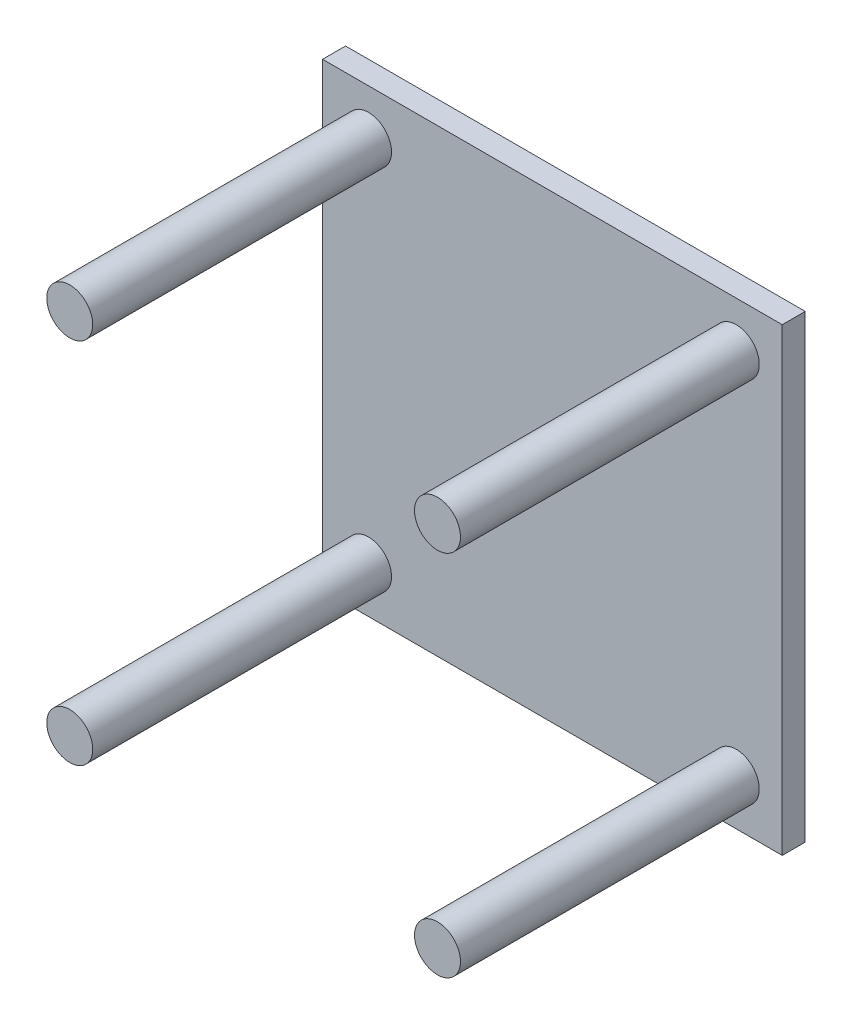
ISO-10303-21;
HEADER;
FILE_DESCRIPTION(('STEP AP214'),'2;1');
FILE_NAME('part.step','',(''),(''),'','','');
FILE_SCHEMA(('AUTOMOTIVE_DESIGN { 1 0 10303 214 1 1 1 1 }'));
ENDSEC;
DATA;
#1=APPLICATION_CONTEXT('core data for automotive mechanical design processes');
#2=APPLICATION_PROTOCOL_DEFINITION('international standard','automotive_design',2000,#1);
#3=PRODUCT_CONTEXT('',#1,'mechanical');
#4=PRODUCT('Part','Part','',(#3));
#5=PRODUCT_RELATED_PRODUCT_CATEGORY('part','',(#4));
#6=PRODUCT_DEFINITION_FORMATION('','',#4);
#7=PRODUCT_DEFINITION_CONTEXT('part definition',#1,'design');
#8=PRODUCT_DEFINITION('design','',#6,#7);
#9=PRODUCT_DEFINITION_SHAPE('','',#8);
#10=(LENGTH_UNIT() NAMED_UNIT(*) SI_UNIT(.MILLI.,.METRE.));
#11=(NAMED_UNIT(*) PLANE_ANGLE_UNIT() SI_UNIT($,.RADIAN.));
#12=(NAMED_UNIT(*) SI_UNIT($,.STERADIAN.) SOLID_ANGLE_UNIT());
#13=UNCERTAINTY_MEASURE_WITH_UNIT(LENGTH_MEASURE(1.E-05),#10,'distance_accuracy_value','');
#14=(GEOMETRIC_REPRESENTATION_CONTEXT(3) GLOBAL_UNCERTAINTY_ASSIGNED_CONTEXT((#13)) GLOBAL_UNIT_ASSIGNED_CONTEXT((#10,
#11,#12)) REPRESENTATION_CONTEXT('',''));
#15=CARTESIAN_POINT('',(0.,0.,0.));
#16=DIRECTION('',(0.,0.,1.));
#17=DIRECTION('',(1.,0.,0.));
#18=AXIS2_PLACEMENT_3D('',#15,#16,#17);
#19=CARTESIAN_POINT('',(500.,-500.,50.));
#20=DIRECTION('',(-1.,0.,0.));
#21=DIRECTION('',(0.,0.,1.));
#22=AXIS2_PLACEMENT_3D('',#19,#20,#21);
#23=PLANE('',#22);
#24=DIRECTION('',(0.,1.,0.));
#25=VECTOR('',#24,1.);
#26=CARTESIAN_POINT('',(500.,-500.,0.));
#27=LINE('',#26,#25);
#28=CARTESIAN_POINT('',(500.,-500.,0.));
#29=VERTEX_POINT('',#28);
#30=CARTESIAN_POINT('',(500.,500.,0.));
#31=VERTEX_POINT('',#30);
#32=EDGE_CURVE('E108',#29,#31,#27,.T.);
#33=ORIENTED_EDGE('',*,*,#32,.T.);
#34=DIRECTION('',(0.,0.,-1.));
#35=VECTOR('',#34,1.);
#36=CARTESIAN_POINT('',(500.,500.,50.));
#37=LINE('',#36,#35);
#38=CARTESIAN_POINT('',(500.,500.,50.));
#39=VERTEX_POINT('',#38);
#40=EDGE_CURVE('E44',#39,#31,#37,.T.);
#41=ORIENTED_EDGE('',*,*,#40,.F.);
#42=DIRECTION('',(0.,1.,0.));
#43=VECTOR('',#42,1.);
#44=CARTESIAN_POINT('',(500.,-500.,50.));
#45=LINE('',#44,#43);
#46=CARTESIAN_POINT('',(500.,-500.,50.));
#47=VERTEX_POINT('',#46);
#48=EDGE_CURVE('E95',#47,#39,#45,.T.);
#49=ORIENTED_EDGE('',*,*,#48,.F.);
#50=DIRECTION('',(0.,0.,-1.));
#51=VECTOR('',#50,1.);
#52=CARTESIAN_POINT('',(500.,-500.,50.));
#53=LINE('',#52,#51);
#54=EDGE_CURVE('E104',#47,#29,#53,.T.);
#55=ORIENTED_EDGE('',*,*,#54,.T.);
#56=EDGE_LOOP('',(#33,#41,#49,#55));
#57=FACE_BOUND('',#56,.T.);
#58=ADVANCED_FACE('F41',(#57),#23,.F.);
#59=CARTESIAN_POINT('',(-500.,500.,50.));
#60=DIRECTION('',(0.,-1.,0.));
#61=DIRECTION('',(0.,0.,-1.));
#62=AXIS2_PLACEMENT_3D('',#59,#60,#61);
#63=PLANE('',#62);
#64=DIRECTION('',(-1.,0.,0.));
#65=VECTOR('',#64,1.);
#66=CARTESIAN_POINT('',(-500.,500.,0.));
#67=LINE('',#66,#65);
#68=CARTESIAN_POINT('',(-500.,500.,0.));
#69=VERTEX_POINT('',#68);
#70=EDGE_CURVE('E100',#31,#69,#67,.T.);
#71=ORIENTED_EDGE('',*,*,#70,.T.);
#72=DIRECTION('',(0.,0.,-1.));
#73=VECTOR('',#72,1.);
#74=CARTESIAN_POINT('',(-500.,500.,50.));
#75=LINE('',#74,#73);
#76=CARTESIAN_POINT('',(-500.,500.,50.));
#77=VERTEX_POINT('',#76);
#78=EDGE_CURVE('E98',#77,#69,#75,.T.);
#79=ORIENTED_EDGE('',*,*,#78,.F.);
#80=DIRECTION('',(-1.,0.,0.));
#81=VECTOR('',#80,1.);
#82=CARTESIAN_POINT('',(-500.,500.,50.));
#83=LINE('',#82,#81);
#84=EDGE_CURVE('E90',#39,#77,#83,.T.);
#85=ORIENTED_EDGE('',*,*,#84,.F.);
#86=ORIENTED_EDGE('',*,*,#40,.T.);
#87=EDGE_LOOP('',(#71,#79,#85,#86));
#88=FACE_BOUND('',#87,.T.);
#89=ADVANCED_FACE('F99',(#88),#63,.F.);
#90=CARTESIAN_POINT('',(-500.,-500.,50.));
#91=DIRECTION('',(1.,0.,0.));
#92=DIRECTION('',(0.,0.,-1.));
#93=AXIS2_PLACEMENT_3D('',#90,#91,#92);
#94=PLANE('',#93);
#95=DIRECTION('',(0.,-1.,0.));
#96=VECTOR('',#95,1.);
#97=CARTESIAN_POINT('',(-500.,-500.,0.));
#98=LINE('',#97,#96);
#99=CARTESIAN_POINT('',(-500.,-500.,0.));
#100=VERTEX_POINT('',#99);
#101=EDGE_CURVE('E76',#69,#100,#98,.T.);
#102=ORIENTED_EDGE('',*,*,#101,.T.);
#103=DIRECTION('',(0.,0.,-1.));
#104=VECTOR('',#103,1.);
#105=CARTESIAN_POINT('',(-500.,-500.,50.));
#106=LINE('',#105,#104);
#107=CARTESIAN_POINT('',(-500.,-500.,50.));
#108=VERTEX_POINT('',#107);
#109=EDGE_CURVE('E101',#108,#100,#106,.T.);
#110=ORIENTED_EDGE('',*,*,#109,.F.);
#111=DIRECTION('',(0.,-1.,0.));
#112=VECTOR('',#111,1.);
#113=CARTESIAN_POINT('',(-500.,-500.,50.));
#114=LINE('',#113,#112);
#115=EDGE_CURVE('E93',#77,#108,#114,.T.);
#116=ORIENTED_EDGE('',*,*,#115,.F.);
#117=ORIENTED_EDGE('',*,*,#78,.T.);
#118=EDGE_LOOP('',(#102,#110,#116,#117));
#119=FACE_BOUND('',#118,.T.);
#120=ADVANCED_FACE('F102',(#119),#94,.F.);
#121=CARTESIAN_POINT('',(-500.,-500.,50.));
#122=DIRECTION('',(0.,1.,0.));
#123=DIRECTION('',(0.,0.,1.));
#124=AXIS2_PLACEMENT_3D('',#121,#122,#123);
#125=PLANE('',#124);
#126=DIRECTION('',(1.,0.,0.));
#127=VECTOR('',#126,1.);
#128=CARTESIAN_POINT('',(-500.,-500.,0.));
#129=LINE('',#128,#127);
#130=EDGE_CURVE('E82',#100,#29,#129,.T.);
#131=ORIENTED_EDGE('',*,*,#130,.T.);
#132=ORIENTED_EDGE('',*,*,#54,.F.);
#133=DIRECTION('',(1.,0.,0.));
#134=VECTOR('',#133,1.);
#135=CARTESIAN_POINT('',(-500.,-500.,50.));
#136=LINE('',#135,#134);
#137=EDGE_CURVE('E59',#108,#47,#136,.T.);
#138=ORIENTED_EDGE('',*,*,#137,.F.);
#139=ORIENTED_EDGE('',*,*,#109,.T.);
#140=EDGE_LOOP('',(#131,#132,#138,#139));
#141=FACE_BOUND('',#140,.T.);
#142=ADVANCED_FACE('F116',(#141),#125,.F.);
#143=CARTESIAN_POINT('',(0.,0.,50.));
#144=DIRECTION('',(0.,0.,-1.));
#145=DIRECTION('',(-1.,0.,0.));
#146=AXIS2_PLACEMENT_3D('',#143,#144,#145);
#147=PLANE('',#146);
#148=CARTESIAN_POINT('',(-400.,-400.,50.));
#149=DIRECTION('',(0.,0.,-1.));
#150=DIRECTION('',(-1.,0.,0.));
#151=AXIS2_PLACEMENT_3D('',#148,#149,#150);
#152=CIRCLE('',#151,50.);
#153=CARTESIAN_POINT('',(-450.,-400.,50.));
#154=VERTEX_POINT('',#153);
#155=EDGE_CURVE('E11',#154,#154,#152,.F.);
#156=ORIENTED_EDGE('',*,*,#155,.F.);
#157=EDGE_LOOP('',(#156));
#158=FACE_BOUND('',#157,.T.);
#159=CARTESIAN_POINT('',(400.,-400.,50.));
#160=DIRECTION('',(0.,0.,-1.));
#161=DIRECTION('',(-1.,0.,0.));
#162=AXIS2_PLACEMENT_3D('',#159,#160,#161);
#163=CIRCLE('',#162,50.);
#164=CARTESIAN_POINT('',(350.,-400.,50.));
#165=VERTEX_POINT('',#164);
#166=EDGE_CURVE('E50',#165,#165,#163,.F.);
#167=ORIENTED_EDGE('',*,*,#166,.F.);
#168=EDGE_LOOP('',(#167));
#169=FACE_BOUND('',#168,.T.);
#170=CARTESIAN_POINT('',(-400.,400.,50.));
#171=DIRECTION('',(0.,0.,-1.));
#172=DIRECTION('',(-1.,0.,0.));
#173=AXIS2_PLACEMENT_3D('',#170,#171,#172);
#174=CIRCLE('',#173,50.);
#175=CARTESIAN_POINT('',(-450.,400.,50.));
#176=VERTEX_POINT('',#175);
#177=EDGE_CURVE('E125',#176,#176,#174,.F.);
#178=ORIENTED_EDGE('',*,*,#177,.F.);
#179=EDGE_LOOP('',(#178));
#180=FACE_BOUND('',#179,.T.);
#181=CARTESIAN_POINT('',(400.,400.,50.));
#182=DIRECTION('',(0.,0.,-1.));
#183=DIRECTION('',(-1.,0.,0.));
#184=AXIS2_PLACEMENT_3D('',#181,#182,#183);
#185=CIRCLE('',#184,50.);
#186=CARTESIAN_POINT('',(350.,400.,50.));
#187=VERTEX_POINT('',#186);
#188=EDGE_CURVE('E122',#187,#187,#185,.F.);
#189=ORIENTED_EDGE('',*,*,#188,.F.);
#190=EDGE_LOOP('',(#189));
#191=FACE_BOUND('',#190,.T.);
#192=ORIENTED_EDGE('',*,*,#48,.T.);
#193=ORIENTED_EDGE('',*,*,#84,.T.);
#194=ORIENTED_EDGE('',*,*,#115,.T.);
#195=ORIENTED_EDGE('',*,*,#137,.T.);
#196=EDGE_LOOP('',(#192,#193,#194,#195));
#197=FACE_BOUND('',#196,.T.);
#198=ADVANCED_FACE('F91',(#158,#169,#180,#191,#197),#147,.F.);
#199=CARTESIAN_POINT('',(0.,0.,0.));
#200=DIRECTION('',(0.,0.,-1.));
#201=DIRECTION('',(-1.,0.,0.));
#202=AXIS2_PLACEMENT_3D('',#199,#200,#201);
#203=PLANE('',#202);
#204=ORIENTED_EDGE('',*,*,#32,.F.);
#205=ORIENTED_EDGE('',*,*,#130,.F.);
#206=ORIENTED_EDGE('',*,*,#101,.F.);
#207=ORIENTED_EDGE('',*,*,#70,.F.);
#208=EDGE_LOOP('',(#204,#205,#206,#207));
#209=FACE_BOUND('',#208,.T.);
#210=ADVANCED_FACE('F119',(#209),#203,.T.);
#211=CARTESIAN_POINT('',(400.,400.,700.));
#212=DIRECTION('',(0.,0.,-1.));
#213=DIRECTION('',(-1.,0.,0.));
#214=AXIS2_PLACEMENT_3D('',#211,#212,#213);
#215=CYLINDRICAL_SURFACE('',#214,50.);
#216=CARTESIAN_POINT('',(400.,400.,700.));
#217=DIRECTION('',(0.,0.,1.));
#218=DIRECTION('',(1.,0.,0.));
#219=AXIS2_PLACEMENT_3D('',#216,#217,#218);
#220=CIRCLE('',#219,50.);
#221=CARTESIAN_POINT('',(450.,400.,700.));
#222=VERTEX_POINT('',#221);
#223=EDGE_CURVE('E111',#222,#222,#220,.T.);
#224=ORIENTED_EDGE('',*,*,#223,.F.);
#225=EDGE_LOOP('',(#224));
#226=FACE_BOUND('',#225,.T.);
#227=ORIENTED_EDGE('',*,*,#188,.T.);
#228=EDGE_LOOP('',(#227));
#229=FACE_BOUND('',#228,.T.);
#230=ADVANCED_FACE('F160',(#226,#229),#215,.T.);
#231=CARTESIAN_POINT('',(400.,400.,700.));
#232=DIRECTION('',(0.,0.,1.));
#233=DIRECTION('',(1.,0.,0.));
#234=AXIS2_PLACEMENT_3D('',#231,#232,#233);
#235=PLANE('',#234);
#236=ORIENTED_EDGE('',*,*,#223,.T.);
#237=EDGE_LOOP('',(#236));
#238=FACE_BOUND('',#237,.T.);
#239=ADVANCED_FACE('F162',(#238),#235,.T.);
#240=CARTESIAN_POINT('',(-400.,400.,700.));
#241=DIRECTION('',(0.,0.,-1.));
#242=DIRECTION('',(-1.,0.,0.));
#243=AXIS2_PLACEMENT_3D('',#240,#241,#242);
#244=CYLINDRICAL_SURFACE('',#243,50.);
#245=CARTESIAN_POINT('',(-400.,400.,700.));
#246=DIRECTION('',(0.,0.,1.));
#247=DIRECTION('',(1.,0.,0.));
#248=AXIS2_PLACEMENT_3D('',#245,#246,#247);
#249=CIRCLE('',#248,50.);
#250=CARTESIAN_POINT('',(-350.,400.,700.));
#251=VERTEX_POINT('',#250);
#252=EDGE_CURVE('E128',#251,#251,#249,.T.);
#253=ORIENTED_EDGE('',*,*,#252,.F.);
#254=EDGE_LOOP('',(#253));
#255=FACE_BOUND('',#254,.T.);
#256=ORIENTED_EDGE('',*,*,#177,.T.);
#257=EDGE_LOOP('',(#256));
#258=FACE_BOUND('',#257,.T.);
#259=ADVANCED_FACE('F169',(#255,#258),#244,.T.);
#260=CARTESIAN_POINT('',(-400.,400.,700.));
#261=DIRECTION('',(0.,0.,1.));
#262=DIRECTION('',(1.,0.,0.));
#263=AXIS2_PLACEMENT_3D('',#260,#261,#262);
#264=PLANE('',#263);
#265=ORIENTED_EDGE('',*,*,#252,.T.);
#266=EDGE_LOOP('',(#265));
#267=FACE_BOUND('',#266,.T.);
#268=ADVANCED_FACE('F228',(#267),#264,.T.);
#269=CARTESIAN_POINT('',(400.,-400.,700.));
#270=DIRECTION('',(0.,0.,-1.));
#271=DIRECTION('',(-1.,0.,0.));
#272=AXIS2_PLACEMENT_3D('',#269,#270,#271);
#273=CYLINDRICAL_SURFACE('',#272,50.);
#274=CARTESIAN_POINT('',(400.,-400.,700.));
#275=DIRECTION('',(0.,0.,1.));
#276=DIRECTION('',(1.,0.,0.));
#277=AXIS2_PLACEMENT_3D('',#274,#275,#276);
#278=CIRCLE('',#277,50.);
#279=CARTESIAN_POINT('',(450.,-400.,700.));
#280=VERTEX_POINT('',#279);
#281=EDGE_CURVE('E133',#280,#280,#278,.T.);
#282=ORIENTED_EDGE('',*,*,#281,.F.);
#283=EDGE_LOOP('',(#282));
#284=FACE_BOUND('',#283,.T.);
#285=ORIENTED_EDGE('',*,*,#166,.T.);
#286=EDGE_LOOP('',(#285));
#287=FACE_BOUND('',#286,.T.);
#288=ADVANCED_FACE('F237',(#284,#287),#273,.T.);
#289=CARTESIAN_POINT('',(400.,-400.,700.));
#290=DIRECTION('',(0.,0.,1.));
#291=DIRECTION('',(1.,0.,0.));
#292=AXIS2_PLACEMENT_3D('',#289,#290,#291);
#293=PLANE('',#292);
#294=ORIENTED_EDGE('',*,*,#281,.T.);
#295=EDGE_LOOP('',(#294));
#296=FACE_BOUND('',#295,.T.);
#297=ADVANCED_FACE('F147',(#296),#293,.T.);
#298=CARTESIAN_POINT('',(-400.,-400.,700.));
#299=DIRECTION('',(0.,0.,-1.));
#300=DIRECTION('',(-1.,0.,0.));
#301=AXIS2_PLACEMENT_3D('',#298,#299,#300);
#302=CYLINDRICAL_SURFACE('',#301,50.);
#303=CARTESIAN_POINT('',(-400.,-400.,700.));
#304=DIRECTION('',(0.,0.,1.));
#305=DIRECTION('',(1.,0.,0.));
#306=AXIS2_PLACEMENT_3D('',#303,#304,#305);
#307=CIRCLE('',#306,50.);
#308=CARTESIAN_POINT('',(-350.,-400.,700.));
#309=VERTEX_POINT('',#308);
#310=EDGE_CURVE('E137',#309,#309,#307,.T.);
#311=ORIENTED_EDGE('',*,*,#310,.F.);
#312=EDGE_LOOP('',(#311));
#313=FACE_BOUND('',#312,.T.);
#314=ORIENTED_EDGE('',*,*,#155,.T.);
#315=EDGE_LOOP('',(#314));
#316=FACE_BOUND('',#315,.T.);
#317=ADVANCED_FACE('F144',(#313,#316),#302,.T.);
#318=CARTESIAN_POINT('',(-400.,-400.,700.));
#319=DIRECTION('',(0.,0.,1.));
#320=DIRECTION('',(1.,0.,0.));
#321=AXIS2_PLACEMENT_3D('',#318,#319,#320);
#322=PLANE('',#321);
#323=ORIENTED_EDGE('',*,*,#310,.T.);
#324=EDGE_LOOP('',(#323));
#325=FACE_BOUND('',#324,.T.);
#326=ADVANCED_FACE('F142',(#325),#322,.T.);
#327=CLOSED_SHELL('',(#58,#89,#120,#142,#198,#210,#230,#239,#259,#268,#288,#297,#317,#326));
#328=MANIFOLD_SOLID_BREP('B2',#327);
#329=ADVANCED_BREP_SHAPE_REPRESENTATION('',(#18,#328),#14);
#330=SHAPE_DEFINITION_REPRESENTATION(#9,#329);
ENDSEC;
END-ISO-10303-21;
